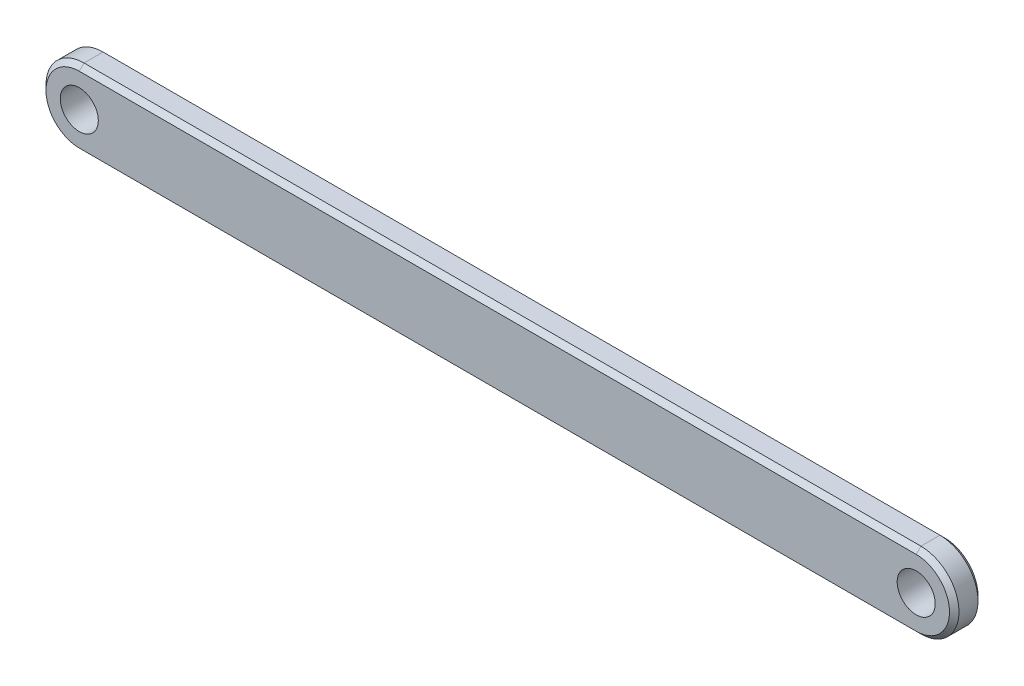
ISO-10303-21;
HEADER;
FILE_DESCRIPTION(('STEP AP214'),'2;1');
FILE_NAME('part.step','',(''),(''),'','','');
FILE_SCHEMA(('AUTOMOTIVE_DESIGN { 1 0 10303 214 1 1 1 1 }'));
ENDSEC;
DATA;
#1=APPLICATION_CONTEXT('core data for automotive mechanical design processes');
#2=APPLICATION_PROTOCOL_DEFINITION('international standard','automotive_design',2000,#1);
#3=PRODUCT_CONTEXT('',#1,'mechanical');
#4=PRODUCT('Part','Part','',(#3));
#5=PRODUCT_RELATED_PRODUCT_CATEGORY('part','',(#4));
#6=PRODUCT_DEFINITION_FORMATION('','',#4);
#7=PRODUCT_DEFINITION_CONTEXT('part definition',#1,'design');
#8=PRODUCT_DEFINITION('design','',#6,#7);
#9=PRODUCT_DEFINITION_SHAPE('','',#8);
#10=(LENGTH_UNIT() NAMED_UNIT(*) SI_UNIT(.MILLI.,.METRE.));
#11=(NAMED_UNIT(*) PLANE_ANGLE_UNIT() SI_UNIT($,.RADIAN.));
#12=(NAMED_UNIT(*) SI_UNIT($,.STERADIAN.) SOLID_ANGLE_UNIT());
#13=UNCERTAINTY_MEASURE_WITH_UNIT(LENGTH_MEASURE(1.E-05),#10,'distance_accuracy_value','');
#14=(GEOMETRIC_REPRESENTATION_CONTEXT(3) GLOBAL_UNCERTAINTY_ASSIGNED_CONTEXT((#13)) GLOBAL_UNIT_ASSIGNED_CONTEXT((#10,
#11,#12)) REPRESENTATION_CONTEXT('',''));
#15=CARTESIAN_POINT('',(0.,0.,0.));
#16=DIRECTION('',(0.,0.,1.));
#17=DIRECTION('',(1.,0.,0.));
#18=AXIS2_PLACEMENT_3D('',#15,#16,#17);
#19=CARTESIAN_POINT('',(44.,0.,1.5));
#20=DIRECTION('',(0.,0.,1.));
#21=DIRECTION('',(1.,0.,0.));
#22=AXIS2_PLACEMENT_3D('',#19,#20,#21);
#23=PLANE('',#22);
#24=DIRECTION('',(1.,0.,0.));
#25=VECTOR('',#24,1.);
#26=CARTESIAN_POINT('',(44.,-3.49999999999998,1.5));
#27=LINE('',#26,#25);
#28=CARTESIAN_POINT('',(-44.,-3.50000000000001,1.5));
#29=VERTEX_POINT('',#28);
#30=CARTESIAN_POINT('',(44.,-3.49999999999998,1.5));
#31=VERTEX_POINT('',#30);
#32=EDGE_CURVE('E109',#29,#31,#27,.T.);
#33=ORIENTED_EDGE('',*,*,#32,.T.);
#34=CARTESIAN_POINT('',(44.,0.,1.5));
#35=DIRECTION('',(0.,0.,1.));
#36=DIRECTION('',(1.,0.,0.));
#37=AXIS2_PLACEMENT_3D('',#34,#35,#36);
#38=CIRCLE('',#37,3.5);
#39=CARTESIAN_POINT('',(44.,3.50000000000002,1.5));
#40=VERTEX_POINT('',#39);
#41=EDGE_CURVE('E105',#31,#40,#38,.T.);
#42=ORIENTED_EDGE('',*,*,#41,.T.);
#43=DIRECTION('',(-1.,0.,0.));
#44=VECTOR('',#43,1.);
#45=CARTESIAN_POINT('',(-44.,3.49999999999999,1.5));
#46=LINE('',#45,#44);
#47=CARTESIAN_POINT('',(-44.,3.49999999999999,1.5));
#48=VERTEX_POINT('',#47);
#49=EDGE_CURVE('E99',#40,#48,#46,.T.);
#50=ORIENTED_EDGE('',*,*,#49,.T.);
#51=CARTESIAN_POINT('',(-44.,0.,1.5));
#52=DIRECTION('',(0.,0.,1.));
#53=DIRECTION('',(1.,0.,0.));
#54=AXIS2_PLACEMENT_3D('',#51,#52,#53);
#55=CIRCLE('',#54,3.5);
#56=EDGE_CURVE('E102',#48,#29,#55,.T.);
#57=ORIENTED_EDGE('',*,*,#56,.T.);
#58=EDGE_LOOP('',(#33,#42,#50,#57));
#59=FACE_BOUND('',#58,.T.);
#60=CARTESIAN_POINT('',(-44.,0.,1.5));
#61=DIRECTION('',(0.,0.,1.));
#62=DIRECTION('',(1.,0.,0.));
#63=AXIS2_PLACEMENT_3D('',#60,#61,#62);
#64=CIRCLE('',#63,2.);
#65=CARTESIAN_POINT('',(-42.,0.,1.5));
#66=VERTEX_POINT('',#65);
#67=EDGE_CURVE('E182',#66,#66,#64,.T.);
#68=ORIENTED_EDGE('',*,*,#67,.F.);
#69=EDGE_LOOP('',(#68));
#70=FACE_BOUND('',#69,.T.);
#71=CARTESIAN_POINT('',(44.,0.,1.5));
#72=DIRECTION('',(0.,0.,1.));
#73=DIRECTION('',(1.,0.,0.));
#74=AXIS2_PLACEMENT_3D('',#71,#72,#73);
#75=CIRCLE('',#74,2.);
#76=CARTESIAN_POINT('',(46.,0.,1.5));
#77=VERTEX_POINT('',#76);
#78=EDGE_CURVE('E186',#77,#77,#75,.T.);
#79=ORIENTED_EDGE('',*,*,#78,.F.);
#80=EDGE_LOOP('',(#79));
#81=FACE_BOUND('',#80,.T.);
#82=ADVANCED_FACE('F32',(#59,#70,#81),#23,.T.);
#83=CARTESIAN_POINT('',(44.,0.,-1.5));
#84=DIRECTION('',(0.,0.,1.));
#85=DIRECTION('',(1.,0.,0.));
#86=AXIS2_PLACEMENT_3D('',#83,#84,#85);
#87=PLANE('',#86);
#88=DIRECTION('',(1.,0.,0.));
#89=VECTOR('',#88,1.);
#90=CARTESIAN_POINT('',(44.,3.50000000000002,-1.5));
#91=LINE('',#90,#89);
#92=CARTESIAN_POINT('',(-44.,3.49999999999999,-1.5));
#93=VERTEX_POINT('',#92);
#94=CARTESIAN_POINT('',(44.,3.50000000000002,-1.5));
#95=VERTEX_POINT('',#94);
#96=EDGE_CURVE('E159',#93,#95,#91,.T.);
#97=ORIENTED_EDGE('',*,*,#96,.T.);
#98=CARTESIAN_POINT('',(44.,0.,-1.5));
#99=DIRECTION('',(0.,0.,1.));
#100=DIRECTION('',(1.,0.,0.));
#101=AXIS2_PLACEMENT_3D('',#98,#99,#100);
#102=CIRCLE('',#101,3.5);
#103=CARTESIAN_POINT('',(44.,-3.49999999999998,-1.5));
#104=VERTEX_POINT('',#103);
#105=EDGE_CURVE('E156',#95,#104,#102,.F.);
#106=ORIENTED_EDGE('',*,*,#105,.T.);
#107=DIRECTION('',(-1.,0.,0.));
#108=VECTOR('',#107,1.);
#109=CARTESIAN_POINT('',(44.,-3.49999999999998,-1.5));
#110=LINE('',#109,#108);
#111=CARTESIAN_POINT('',(-44.,-3.50000000000001,-1.5));
#112=VERTEX_POINT('',#111);
#113=EDGE_CURVE('E161',#104,#112,#110,.T.);
#114=ORIENTED_EDGE('',*,*,#113,.T.);
#115=CARTESIAN_POINT('',(-44.,0.,-1.5));
#116=DIRECTION('',(0.,0.,1.));
#117=DIRECTION('',(1.,0.,0.));
#118=AXIS2_PLACEMENT_3D('',#115,#116,#117);
#119=CIRCLE('',#118,3.5);
#120=EDGE_CURVE('E163',#112,#93,#119,.F.);
#121=ORIENTED_EDGE('',*,*,#120,.T.);
#122=EDGE_LOOP('',(#97,#106,#114,#121));
#123=FACE_BOUND('',#122,.T.);
#124=CARTESIAN_POINT('',(-44.,0.,-1.5));
#125=DIRECTION('',(0.,0.,1.));
#126=DIRECTION('',(1.,0.,0.));
#127=AXIS2_PLACEMENT_3D('',#124,#125,#126);
#128=CIRCLE('',#127,2.);
#129=CARTESIAN_POINT('',(-42.,0.,-1.5));
#130=VERTEX_POINT('',#129);
#131=EDGE_CURVE('E183',#130,#130,#128,.T.);
#132=ORIENTED_EDGE('',*,*,#131,.T.);
#133=EDGE_LOOP('',(#132));
#134=FACE_BOUND('',#133,.T.);
#135=CARTESIAN_POINT('',(44.,0.,-1.5));
#136=DIRECTION('',(0.,0.,1.));
#137=DIRECTION('',(1.,0.,0.));
#138=AXIS2_PLACEMENT_3D('',#135,#136,#137);
#139=CIRCLE('',#138,2.);
#140=CARTESIAN_POINT('',(46.,0.,-1.5));
#141=VERTEX_POINT('',#140);
#142=EDGE_CURVE('E126',#141,#141,#139,.T.);
#143=ORIENTED_EDGE('',*,*,#142,.T.);
#144=EDGE_LOOP('',(#143));
#145=FACE_BOUND('',#144,.T.);
#146=ADVANCED_FACE('F198',(#123,#134,#145),#87,.F.);
#147=CARTESIAN_POINT('',(44.,0.,1.5));
#148=DIRECTION('',(0.,0.,-1.));
#149=DIRECTION('',(-1.,0.,0.));
#150=AXIS2_PLACEMENT_3D('',#147,#148,#149);
#151=CYLINDRICAL_SURFACE('',#150,4.);
#152=DIRECTION('',(0.,0.,-1.));
#153=VECTOR('',#152,1.);
#154=CARTESIAN_POINT('',(44.,4.00000000000002,1.5));
#155=LINE('',#154,#153);
#156=CARTESIAN_POINT('',(44.,4.00000000000002,1.));
#157=VERTEX_POINT('',#156);
#158=CARTESIAN_POINT('',(44.,4.00000000000002,-1.00000000000002));
#159=VERTEX_POINT('',#158);
#160=EDGE_CURVE('E120',#157,#159,#155,.T.);
#161=ORIENTED_EDGE('',*,*,#160,.F.);
#162=CARTESIAN_POINT('',(44.,0.,1.));
#163=DIRECTION('',(0.,0.,1.));
#164=DIRECTION('',(1.,0.,0.));
#165=AXIS2_PLACEMENT_3D('',#162,#163,#164);
#166=CIRCLE('',#165,4.);
#167=CARTESIAN_POINT('',(44.,-3.99999999999998,1.));
#168=VERTEX_POINT('',#167);
#169=EDGE_CURVE('E165',#157,#168,#166,.F.);
#170=ORIENTED_EDGE('',*,*,#169,.T.);
#171=DIRECTION('',(0.,0.,-1.));
#172=VECTOR('',#171,1.);
#173=CARTESIAN_POINT('',(44.,-3.99999999999998,1.5));
#174=LINE('',#173,#172);
#175=CARTESIAN_POINT('',(44.,-3.99999999999998,-1.00000000000002));
#176=VERTEX_POINT('',#175);
#177=EDGE_CURVE('E179',#168,#176,#174,.T.);
#178=ORIENTED_EDGE('',*,*,#177,.T.);
#179=CARTESIAN_POINT('',(44.,0.,-1.00000000000002));
#180=DIRECTION('',(0.,0.,1.));
#181=DIRECTION('',(1.,0.,0.));
#182=AXIS2_PLACEMENT_3D('',#179,#180,#181);
#183=CIRCLE('',#182,4.);
#184=EDGE_CURVE('E168',#176,#159,#183,.T.);
#185=ORIENTED_EDGE('',*,*,#184,.T.);
#186=EDGE_LOOP('',(#161,#170,#178,#185));
#187=FACE_BOUND('',#186,.T.);
#188=ADVANCED_FACE('F203',(#187),#151,.T.);
#189=CARTESIAN_POINT('',(44.,4.00000000000002,1.5));
#190=DIRECTION('',(0.,-1.,0.));
#191=DIRECTION('',(1.,0.,0.));
#192=AXIS2_PLACEMENT_3D('',#189,#190,#191);
#193=PLANE('',#192);
#194=ORIENTED_EDGE('',*,*,#160,.T.);
#195=DIRECTION('',(-1.,0.,0.));
#196=VECTOR('',#195,1.);
#197=CARTESIAN_POINT('',(44.,4.00000000000002,-1.00000000000002));
#198=LINE('',#197,#196);
#199=CARTESIAN_POINT('',(-44.,3.99999999999999,-1.00000000000002));
#200=VERTEX_POINT('',#199);
#201=EDGE_CURVE('E153',#159,#200,#198,.T.);
#202=ORIENTED_EDGE('',*,*,#201,.T.);
#203=DIRECTION('',(0.,0.,-1.));
#204=VECTOR('',#203,1.);
#205=CARTESIAN_POINT('',(-44.,3.99999999999999,1.5));
#206=LINE('',#205,#204);
#207=CARTESIAN_POINT('',(-44.,3.99999999999999,1.));
#208=VERTEX_POINT('',#207);
#209=EDGE_CURVE('E175',#208,#200,#206,.T.);
#210=ORIENTED_EDGE('',*,*,#209,.F.);
#211=DIRECTION('',(1.,0.,0.));
#212=VECTOR('',#211,1.);
#213=CARTESIAN_POINT('',(44.,4.00000000000002,1.));
#214=LINE('',#213,#212);
#215=EDGE_CURVE('E123',#208,#157,#214,.T.);
#216=ORIENTED_EDGE('',*,*,#215,.T.);
#217=EDGE_LOOP('',(#194,#202,#210,#216));
#218=FACE_BOUND('',#217,.T.);
#219=ADVANCED_FACE('F216',(#218),#193,.F.);
#220=CARTESIAN_POINT('',(-44.,0.,1.5));
#221=DIRECTION('',(0.,0.,-1.));
#222=DIRECTION('',(-1.,0.,0.));
#223=AXIS2_PLACEMENT_3D('',#220,#221,#222);
#224=CYLINDRICAL_SURFACE('',#223,4.);
#225=ORIENTED_EDGE('',*,*,#209,.T.);
#226=CARTESIAN_POINT('',(-44.,0.,-1.00000000000002));
#227=DIRECTION('',(0.,0.,1.));
#228=DIRECTION('',(1.,0.,0.));
#229=AXIS2_PLACEMENT_3D('',#226,#227,#228);
#230=CIRCLE('',#229,4.);
#231=CARTESIAN_POINT('',(-44.,-4.00000000000001,-1.00000000000002));
#232=VERTEX_POINT('',#231);
#233=EDGE_CURVE('E11',#200,#232,#230,.T.);
#234=ORIENTED_EDGE('',*,*,#233,.T.);
#235=DIRECTION('',(0.,0.,-1.));
#236=VECTOR('',#235,1.);
#237=CARTESIAN_POINT('',(-44.,-4.00000000000001,1.5));
#238=LINE('',#237,#236);
#239=CARTESIAN_POINT('',(-44.,-4.00000000000001,1.));
#240=VERTEX_POINT('',#239);
#241=EDGE_CURVE('E177',#240,#232,#238,.T.);
#242=ORIENTED_EDGE('',*,*,#241,.F.);
#243=CARTESIAN_POINT('',(-44.,0.,1.));
#244=DIRECTION('',(0.,0.,1.));
#245=DIRECTION('',(1.,0.,0.));
#246=AXIS2_PLACEMENT_3D('',#243,#244,#245);
#247=CIRCLE('',#246,4.);
#248=EDGE_CURVE('E41',#240,#208,#247,.F.);
#249=ORIENTED_EDGE('',*,*,#248,.T.);
#250=EDGE_LOOP('',(#225,#234,#242,#249));
#251=FACE_BOUND('',#250,.T.);
#252=ADVANCED_FACE('F213',(#251),#224,.T.);
#253=CARTESIAN_POINT('',(44.,-3.99999999999998,1.5));
#254=DIRECTION('',(0.,1.,0.));
#255=DIRECTION('',(-1.,0.,0.));
#256=AXIS2_PLACEMENT_3D('',#253,#254,#255);
#257=PLANE('',#256);
#258=ORIENTED_EDGE('',*,*,#241,.T.);
#259=DIRECTION('',(1.,0.,0.));
#260=VECTOR('',#259,1.);
#261=CARTESIAN_POINT('',(44.,-3.99999999999998,-1.00000000000002));
#262=LINE('',#261,#260);
#263=EDGE_CURVE('E150',#232,#176,#262,.T.);
#264=ORIENTED_EDGE('',*,*,#263,.T.);
#265=ORIENTED_EDGE('',*,*,#177,.F.);
#266=DIRECTION('',(-1.,0.,0.));
#267=VECTOR('',#266,1.);
#268=CARTESIAN_POINT('',(-44.,-4.00000000000001,1.));
#269=LINE('',#268,#267);
#270=EDGE_CURVE('E54',#168,#240,#269,.T.);
#271=ORIENTED_EDGE('',*,*,#270,.T.);
#272=EDGE_LOOP('',(#258,#264,#265,#271));
#273=FACE_BOUND('',#272,.T.);
#274=ADVANCED_FACE('F210',(#273),#257,.F.);
#275=CARTESIAN_POINT('',(-44.,0.,1.5));
#276=DIRECTION('',(0.,0.,-1.));
#277=DIRECTION('',(-1.,0.,0.));
#278=AXIS2_PLACEMENT_3D('',#275,#276,#277);
#279=CYLINDRICAL_SURFACE('',#278,2.);
#280=ORIENTED_EDGE('',*,*,#67,.T.);
#281=EDGE_LOOP('',(#280));
#282=FACE_BOUND('',#281,.T.);
#283=ORIENTED_EDGE('',*,*,#131,.F.);
#284=EDGE_LOOP('',(#283));
#285=FACE_BOUND('',#284,.T.);
#286=ADVANCED_FACE('F207',(#282,#285),#279,.F.);
#287=CARTESIAN_POINT('',(44.,0.,1.5));
#288=DIRECTION('',(0.,0.,-1.));
#289=DIRECTION('',(-1.,0.,0.));
#290=AXIS2_PLACEMENT_3D('',#287,#288,#289);
#291=CYLINDRICAL_SURFACE('',#290,2.);
#292=ORIENTED_EDGE('',*,*,#78,.T.);
#293=EDGE_LOOP('',(#292));
#294=FACE_BOUND('',#293,.T.);
#295=ORIENTED_EDGE('',*,*,#142,.F.);
#296=EDGE_LOOP('',(#295));
#297=FACE_BOUND('',#296,.T.);
#298=ADVANCED_FACE('F194',(#294,#297),#291,.F.);
#299=CARTESIAN_POINT('',(-44.,0.,1.5));
#300=DIRECTION('',(0.,0.,-1.));
#301=DIRECTION('',(-1.,0.,0.));
#302=AXIS2_PLACEMENT_3D('',#299,#300,#301);
#303=CONICAL_SURFACE('',#302,3.5,0.785398163397452);
#304=DIRECTION('',(0.,-0.70710678118655,0.707106781186545));
#305=VECTOR('',#304,1.);
#306=CARTESIAN_POINT('',(-44.,3.99999999999999,1.));
#307=LINE('',#306,#305);
#308=EDGE_CURVE('E115',#208,#48,#307,.T.);
#309=ORIENTED_EDGE('',*,*,#308,.F.);
#310=ORIENTED_EDGE('',*,*,#248,.F.);
#311=DIRECTION('',(0.,-0.70710678118655,-0.707106781186545));
#312=VECTOR('',#311,1.);
#313=CARTESIAN_POINT('',(-44.,-3.50000000000001,1.5));
#314=LINE('',#313,#312);
#315=EDGE_CURVE('E118',#29,#240,#314,.T.);
#316=ORIENTED_EDGE('',*,*,#315,.F.);
#317=ORIENTED_EDGE('',*,*,#56,.F.);
#318=EDGE_LOOP('',(#309,#310,#316,#317));
#319=FACE_BOUND('',#318,.T.);
#320=ADVANCED_FACE('F113',(#319),#303,.T.);
#321=CARTESIAN_POINT('',(44.,-3.49999999999998,1.5));
#322=DIRECTION('',(0.,-0.707106781186545,0.70710678118655));
#323=DIRECTION('',(-1.,0.,0.));
#324=AXIS2_PLACEMENT_3D('',#321,#322,#323);
#325=PLANE('',#324);
#326=ORIENTED_EDGE('',*,*,#315,.T.);
#327=ORIENTED_EDGE('',*,*,#270,.F.);
#328=DIRECTION('',(0.,-0.70710678118655,-0.707106781186545));
#329=VECTOR('',#328,1.);
#330=CARTESIAN_POINT('',(44.,-3.49999999999998,1.5));
#331=LINE('',#330,#329);
#332=EDGE_CURVE('E124',#31,#168,#331,.T.);
#333=ORIENTED_EDGE('',*,*,#332,.F.);
#334=ORIENTED_EDGE('',*,*,#32,.F.);
#335=EDGE_LOOP('',(#326,#327,#333,#334));
#336=FACE_BOUND('',#335,.T.);
#337=ADVANCED_FACE('F228',(#336),#325,.T.);
#338=CARTESIAN_POINT('',(44.,3.50000000000002,1.5));
#339=DIRECTION('',(0.,0.707106781186545,0.70710678118655));
#340=DIRECTION('',(1.,0.,0.));
#341=AXIS2_PLACEMENT_3D('',#338,#339,#340);
#342=PLANE('',#341);
#343=ORIENTED_EDGE('',*,*,#308,.T.);
#344=ORIENTED_EDGE('',*,*,#49,.F.);
#345=DIRECTION('',(0.,-0.70710678118655,0.707106781186545));
#346=VECTOR('',#345,1.);
#347=CARTESIAN_POINT('',(44.,4.00000000000002,1.));
#348=LINE('',#347,#346);
#349=EDGE_CURVE('E128',#157,#40,#348,.T.);
#350=ORIENTED_EDGE('',*,*,#349,.F.);
#351=ORIENTED_EDGE('',*,*,#215,.F.);
#352=EDGE_LOOP('',(#343,#344,#350,#351));
#353=FACE_BOUND('',#352,.T.);
#354=ADVANCED_FACE('F122',(#353),#342,.T.);
#355=CARTESIAN_POINT('',(44.,0.,1.5));
#356=DIRECTION('',(0.,0.,-1.));
#357=DIRECTION('',(-1.,0.,0.));
#358=AXIS2_PLACEMENT_3D('',#355,#356,#357);
#359=CONICAL_SURFACE('',#358,3.5,0.785398163397452);
#360=ORIENTED_EDGE('',*,*,#332,.T.);
#361=ORIENTED_EDGE('',*,*,#169,.F.);
#362=ORIENTED_EDGE('',*,*,#349,.T.);
#363=ORIENTED_EDGE('',*,*,#41,.F.);
#364=EDGE_LOOP('',(#360,#361,#362,#363));
#365=FACE_BOUND('',#364,.T.);
#366=ADVANCED_FACE('F223',(#365),#359,.T.);
#367=CARTESIAN_POINT('',(-44.,0.,-1.00000000000002));
#368=DIRECTION('',(0.,0.,1.));
#369=DIRECTION('',(1.,0.,0.));
#370=AXIS2_PLACEMENT_3D('',#367,#368,#369);
#371=CONICAL_SURFACE('',#370,4.,0.785398163397466);
#372=DIRECTION('',(0.,0.707106781186559,0.707106781186536));
#373=VECTOR('',#372,1.);
#374=CARTESIAN_POINT('',(-44.,3.49999999999999,-1.5));
#375=LINE('',#374,#373);
#376=EDGE_CURVE('E135',#93,#200,#375,.T.);
#377=ORIENTED_EDGE('',*,*,#376,.F.);
#378=ORIENTED_EDGE('',*,*,#120,.F.);
#379=DIRECTION('',(0.,0.70710678118656,-0.707106781186535));
#380=VECTOR('',#379,1.);
#381=CARTESIAN_POINT('',(-44.,-4.00000000000001,-1.00000000000002));
#382=LINE('',#381,#380);
#383=EDGE_CURVE('E36',#232,#112,#382,.T.);
#384=ORIENTED_EDGE('',*,*,#383,.F.);
#385=ORIENTED_EDGE('',*,*,#233,.F.);
#386=EDGE_LOOP('',(#377,#378,#384,#385));
#387=FACE_BOUND('',#386,.T.);
#388=ADVANCED_FACE('F34',(#387),#371,.T.);
#389=CARTESIAN_POINT('',(44.,-3.99999999999998,-1.00000000000002));
#390=DIRECTION('',(0.,0.707106781186535,0.70710678118656));
#391=DIRECTION('',(1.,0.,0.));
#392=AXIS2_PLACEMENT_3D('',#389,#390,#391);
#393=PLANE('',#392);
#394=ORIENTED_EDGE('',*,*,#383,.T.);
#395=ORIENTED_EDGE('',*,*,#113,.F.);
#396=DIRECTION('',(0.,0.70710678118656,-0.707106781186535));
#397=VECTOR('',#396,1.);
#398=CARTESIAN_POINT('',(44.,-3.99999999999998,-1.00000000000002));
#399=LINE('',#398,#397);
#400=EDGE_CURVE('E134',#176,#104,#399,.T.);
#401=ORIENTED_EDGE('',*,*,#400,.F.);
#402=ORIENTED_EDGE('',*,*,#263,.F.);
#403=EDGE_LOOP('',(#394,#395,#401,#402));
#404=FACE_BOUND('',#403,.T.);
#405=ADVANCED_FACE('F240',(#404),#393,.F.);
#406=CARTESIAN_POINT('',(44.,4.00000000000002,-1.00000000000002));
#407=DIRECTION('',(0.,-0.707106781186535,0.70710678118656));
#408=DIRECTION('',(-1.,0.,0.));
#409=AXIS2_PLACEMENT_3D('',#406,#407,#408);
#410=PLANE('',#409);
#411=ORIENTED_EDGE('',*,*,#376,.T.);
#412=ORIENTED_EDGE('',*,*,#201,.F.);
#413=DIRECTION('',(0.,0.70710678118656,0.707106781186535));
#414=VECTOR('',#413,1.);
#415=CARTESIAN_POINT('',(44.,3.50000000000002,-1.5));
#416=LINE('',#415,#414);
#417=EDGE_CURVE('E132',#95,#159,#416,.T.);
#418=ORIENTED_EDGE('',*,*,#417,.F.);
#419=ORIENTED_EDGE('',*,*,#96,.F.);
#420=EDGE_LOOP('',(#411,#412,#418,#419));
#421=FACE_BOUND('',#420,.T.);
#422=ADVANCED_FACE('F237',(#421),#410,.F.);
#423=CARTESIAN_POINT('',(44.,0.,-1.00000000000002));
#424=DIRECTION('',(0.,0.,1.));
#425=DIRECTION('',(1.,0.,0.));
#426=AXIS2_PLACEMENT_3D('',#423,#424,#425);
#427=CONICAL_SURFACE('',#426,4.,0.785398163397466);
#428=ORIENTED_EDGE('',*,*,#400,.T.);
#429=ORIENTED_EDGE('',*,*,#105,.F.);
#430=ORIENTED_EDGE('',*,*,#417,.T.);
#431=ORIENTED_EDGE('',*,*,#184,.F.);
#432=EDGE_LOOP('',(#428,#429,#430,#431));
#433=FACE_BOUND('',#432,.T.);
#434=ADVANCED_FACE('F234',(#433),#427,.T.);
#435=CLOSED_SHELL('',(#82,#146,#188,#219,#252,#274,#286,#298,#320,#337,#354,#366,#388,#405,#422,#434));
#436=MANIFOLD_SOLID_BREP('B2',#435);
#437=ADVANCED_BREP_SHAPE_REPRESENTATION('',(#18,#436),#14);
#438=SHAPE_DEFINITION_REPRESENTATION(#9,#437);
ENDSEC;
END-ISO-10303-21;
